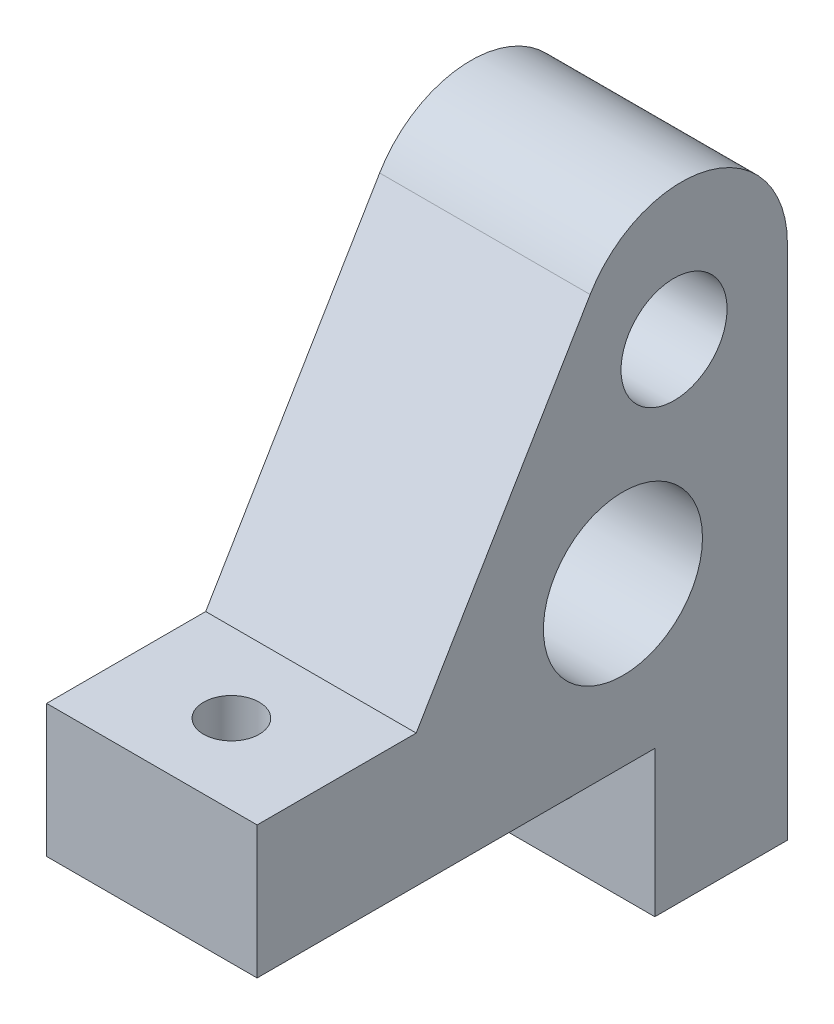
ISO-10303-21;
HEADER;
FILE_DESCRIPTION(('STEP AP214'),'2;1');
FILE_NAME('part.step','',(''),(''),'','','');
FILE_SCHEMA(('AUTOMOTIVE_DESIGN { 1 0 10303 214 1 1 1 1 }'));
ENDSEC;
DATA;
#1=APPLICATION_CONTEXT('core data for automotive mechanical design processes');
#2=APPLICATION_PROTOCOL_DEFINITION('international standard','automotive_design',2000,#1);
#3=PRODUCT_CONTEXT('',#1,'mechanical');
#4=PRODUCT('Part','Part','',(#3));
#5=PRODUCT_RELATED_PRODUCT_CATEGORY('part','',(#4));
#6=PRODUCT_DEFINITION_FORMATION('','',#4);
#7=PRODUCT_DEFINITION_CONTEXT('part definition',#1,'design');
#8=PRODUCT_DEFINITION('design','',#6,#7);
#9=PRODUCT_DEFINITION_SHAPE('','',#8);
#10=(LENGTH_UNIT() NAMED_UNIT(*) SI_UNIT(.MILLI.,.METRE.));
#11=(NAMED_UNIT(*) PLANE_ANGLE_UNIT() SI_UNIT($,.RADIAN.));
#12=(NAMED_UNIT(*) SI_UNIT($,.STERADIAN.) SOLID_ANGLE_UNIT());
#13=UNCERTAINTY_MEASURE_WITH_UNIT(LENGTH_MEASURE(1.E-05),#10,'distance_accuracy_value','');
#14=(GEOMETRIC_REPRESENTATION_CONTEXT(3) GLOBAL_UNCERTAINTY_ASSIGNED_CONTEXT((#13)) GLOBAL_UNIT_ASSIGNED_CONTEXT((#10,
#11,#12)) REPRESENTATION_CONTEXT('',''));
#15=CARTESIAN_POINT('',(0.,0.,0.));
#16=DIRECTION('',(0.,0.,1.));
#17=DIRECTION('',(1.,0.,0.));
#18=AXIS2_PLACEMENT_3D('',#15,#16,#17);
#19=CARTESIAN_POINT('',(7.94,28.,0.));
#20=DIRECTION('',(0.,0.,1.));
#21=DIRECTION('',(1.,0.,0.));
#22=AXIS2_PLACEMENT_3D('',#19,#20,#21);
#23=PLANE('',#22);
#24=CARTESIAN_POINT('',(0.,-4.99999999999983,-1.89735088484975E-12));
#25=DIRECTION('',(0.,0.,-1.));
#26=DIRECTION('',(-1.,0.,0.));
#27=AXIS2_PLACEMENT_3D('',#24,#25,#26);
#28=CIRCLE('',#27,2.09999999999999);
#29=CARTESIAN_POINT('',(-2.09999999999999,-4.99999999999983,-1.89735088484975E-12));
#30=VERTEX_POINT('',#29);
#31=EDGE_CURVE('E178',#30,#30,#28,.T.);
#32=ORIENTED_EDGE('',*,*,#31,.F.);
#33=EDGE_LOOP('',(#32));
#34=FACE_BOUND('',#33,.T.);
#35=DIRECTION('',(0.,1.,0.));
#36=VECTOR('',#35,1.);
#37=CARTESIAN_POINT('',(-7.94,28.,0.));
#38=LINE('',#37,#36);
#39=CARTESIAN_POINT('',(-7.94,-11.,0.));
#40=VERTEX_POINT('',#39);
#41=CARTESIAN_POINT('',(-7.94,28.,0.));
#42=VERTEX_POINT('',#41);
#43=EDGE_CURVE('E100',#40,#42,#38,.T.);
#44=ORIENTED_EDGE('',*,*,#43,.T.);
#45=DIRECTION('',(-1.,0.,0.));
#46=VECTOR('',#45,1.);
#47=CARTESIAN_POINT('',(7.94,28.,0.));
#48=LINE('',#47,#46);
#49=CARTESIAN_POINT('',(7.94,28.,0.));
#50=VERTEX_POINT('',#49);
#51=EDGE_CURVE('E13',#50,#42,#48,.T.);
#52=ORIENTED_EDGE('',*,*,#51,.F.);
#53=DIRECTION('',(0.,1.,0.));
#54=VECTOR('',#53,1.);
#55=CARTESIAN_POINT('',(7.94,-11.,0.));
#56=LINE('',#55,#54);
#57=CARTESIAN_POINT('',(7.94,-11.,0.));
#58=VERTEX_POINT('',#57);
#59=EDGE_CURVE('E106',#58,#50,#56,.T.);
#60=ORIENTED_EDGE('',*,*,#59,.F.);
#61=DIRECTION('',(-1.,0.,0.));
#62=VECTOR('',#61,1.);
#63=CARTESIAN_POINT('',(7.94,-11.,0.));
#64=LINE('',#63,#62);
#65=EDGE_CURVE('E140',#58,#40,#64,.T.);
#66=ORIENTED_EDGE('',*,*,#65,.T.);
#67=EDGE_LOOP('',(#44,#52,#60,#66));
#68=FACE_BOUND('',#67,.T.);
#69=ADVANCED_FACE('F46',(#34,#68),#23,.F.);
#70=CARTESIAN_POINT('',(7.94,28.,8.));
#71=DIRECTION('',(-1.,0.,0.));
#72=DIRECTION('',(0.,0.,1.));
#73=AXIS2_PLACEMENT_3D('',#70,#71,#72);
#74=CYLINDRICAL_SURFACE('',#73,8.);
#75=CARTESIAN_POINT('',(-7.94,28.,8.));
#76=DIRECTION('',(1.,0.,0.));
#77=DIRECTION('',(0.,0.,1.));
#78=AXIS2_PLACEMENT_3D('',#75,#76,#77);
#79=CIRCLE('',#78,8.);
#80=CARTESIAN_POINT('',(-7.94,32.0862906425039,14.8776615782535));
#81=VERTEX_POINT('',#80);
#82=EDGE_CURVE('E145',#42,#81,#79,.T.);
#83=ORIENTED_EDGE('',*,*,#82,.T.);
#84=DIRECTION('',(-1.,0.,0.));
#85=VECTOR('',#84,1.);
#86=CARTESIAN_POINT('',(7.94,32.0862906425039,14.8776615782535));
#87=LINE('',#86,#85);
#88=CARTESIAN_POINT('',(7.94,32.0862906425039,14.8776615782535));
#89=VERTEX_POINT('',#88);
#90=EDGE_CURVE('E55',#89,#81,#87,.T.);
#91=ORIENTED_EDGE('',*,*,#90,.F.);
#92=CARTESIAN_POINT('',(7.94,28.,8.));
#93=DIRECTION('',(1.,0.,0.));
#94=DIRECTION('',(0.,0.,1.));
#95=AXIS2_PLACEMENT_3D('',#92,#93,#94);
#96=CIRCLE('',#95,8.);
#97=EDGE_CURVE('E183',#50,#89,#96,.T.);
#98=ORIENTED_EDGE('',*,*,#97,.F.);
#99=ORIENTED_EDGE('',*,*,#51,.T.);
#100=EDGE_LOOP('',(#83,#91,#98,#99));
#101=FACE_BOUND('',#100,.T.);
#102=ADVANCED_FACE('F205',(#101),#74,.T.);
#103=CARTESIAN_POINT('',(7.94,32.0862906425039,14.8776615782535));
#104=DIRECTION('',(0.,-0.51078633031299,-0.859707697281692));
#105=DIRECTION('',(0.,0.859707697281692,-0.51078633031299));
#106=AXIS2_PLACEMENT_3D('',#103,#104,#105);
#107=PLANE('',#106);
#108=DIRECTION('',(0.,-0.859707697281692,0.51078633031299));
#109=VECTOR('',#108,1.);
#110=CARTESIAN_POINT('',(-7.94,32.0862906425039,14.8776615782535));
#111=LINE('',#110,#109);
#112=CARTESIAN_POINT('',(-7.94,10.,28.));
#113=VERTEX_POINT('',#112);
#114=EDGE_CURVE('E148',#81,#113,#111,.T.);
#115=ORIENTED_EDGE('',*,*,#114,.T.);
#116=DIRECTION('',(-1.,0.,0.));
#117=VECTOR('',#116,1.);
#118=CARTESIAN_POINT('',(7.94,10.,28.));
#119=LINE('',#118,#117);
#120=CARTESIAN_POINT('',(7.94,10.,28.));
#121=VERTEX_POINT('',#120);
#122=EDGE_CURVE('E165',#121,#113,#119,.T.);
#123=ORIENTED_EDGE('',*,*,#122,.F.);
#124=DIRECTION('',(0.,-0.859707697281692,0.51078633031299));
#125=VECTOR('',#124,1.);
#126=CARTESIAN_POINT('',(7.94,32.0862906425039,14.8776615782535));
#127=LINE('',#126,#125);
#128=EDGE_CURVE('E185',#89,#121,#127,.T.);
#129=ORIENTED_EDGE('',*,*,#128,.F.);
#130=ORIENTED_EDGE('',*,*,#90,.T.);
#131=EDGE_LOOP('',(#115,#123,#129,#130));
#132=FACE_BOUND('',#131,.T.);
#133=ADVANCED_FACE('F208',(#132),#107,.F.);
#134=CARTESIAN_POINT('',(7.94,10.,28.));
#135=DIRECTION('',(0.,-1.,0.));
#136=DIRECTION('',(0.,0.,-1.));
#137=AXIS2_PLACEMENT_3D('',#134,#135,#136);
#138=PLANE('',#137);
#139=CARTESIAN_POINT('',(0.,10.,33.9999999999962));
#140=DIRECTION('',(0.,1.,0.));
#141=DIRECTION('',(0.,0.,1.));
#142=AXIS2_PLACEMENT_3D('',#139,#140,#141);
#143=CIRCLE('',#142,2.09999999999999);
#144=CARTESIAN_POINT('',(0.,10.,36.0999999999962));
#145=VERTEX_POINT('',#144);
#146=EDGE_CURVE('E170',#145,#145,#143,.T.);
#147=ORIENTED_EDGE('',*,*,#146,.F.);
#148=EDGE_LOOP('',(#147));
#149=FACE_BOUND('',#148,.T.);
#150=DIRECTION('',(0.,0.,1.));
#151=VECTOR('',#150,1.);
#152=CARTESIAN_POINT('',(-7.94,10.,28.));
#153=LINE('',#152,#151);
#154=CARTESIAN_POINT('',(-7.94,10.,40.));
#155=VERTEX_POINT('',#154);
#156=EDGE_CURVE('E150',#113,#155,#153,.T.);
#157=ORIENTED_EDGE('',*,*,#156,.T.);
#158=DIRECTION('',(-1.,0.,0.));
#159=VECTOR('',#158,1.);
#160=CARTESIAN_POINT('',(7.94,10.,40.));
#161=LINE('',#160,#159);
#162=CARTESIAN_POINT('',(7.94,10.,40.));
#163=VERTEX_POINT('',#162);
#164=EDGE_CURVE('E162',#163,#155,#161,.T.);
#165=ORIENTED_EDGE('',*,*,#164,.F.);
#166=DIRECTION('',(0.,0.,1.));
#167=VECTOR('',#166,1.);
#168=CARTESIAN_POINT('',(7.94,10.,28.));
#169=LINE('',#168,#167);
#170=EDGE_CURVE('E187',#121,#163,#169,.T.);
#171=ORIENTED_EDGE('',*,*,#170,.F.);
#172=ORIENTED_EDGE('',*,*,#122,.T.);
#173=EDGE_LOOP('',(#157,#165,#171,#172));
#174=FACE_BOUND('',#173,.T.);
#175=ADVANCED_FACE('F193',(#149,#174),#138,.F.);
#176=CARTESIAN_POINT('',(7.94,10.,40.));
#177=DIRECTION('',(0.,0.,-1.));
#178=DIRECTION('',(-1.,0.,0.));
#179=AXIS2_PLACEMENT_3D('',#176,#177,#178);
#180=PLANE('',#179);
#181=DIRECTION('',(0.,-1.,0.));
#182=VECTOR('',#181,1.);
#183=CARTESIAN_POINT('',(-7.94,10.,40.));
#184=LINE('',#183,#182);
#185=CARTESIAN_POINT('',(-7.94,0.,40.));
#186=VERTEX_POINT('',#185);
#187=EDGE_CURVE('E152',#155,#186,#184,.T.);
#188=ORIENTED_EDGE('',*,*,#187,.T.);
#189=DIRECTION('',(-1.,0.,0.));
#190=VECTOR('',#189,1.);
#191=CARTESIAN_POINT('',(7.94,0.,40.));
#192=LINE('',#191,#190);
#193=CARTESIAN_POINT('',(7.94,0.,40.));
#194=VERTEX_POINT('',#193);
#195=EDGE_CURVE('E135',#194,#186,#192,.T.);
#196=ORIENTED_EDGE('',*,*,#195,.F.);
#197=DIRECTION('',(0.,-1.,0.));
#198=VECTOR('',#197,1.);
#199=CARTESIAN_POINT('',(7.94,10.,40.));
#200=LINE('',#199,#198);
#201=EDGE_CURVE('E126',#163,#194,#200,.T.);
#202=ORIENTED_EDGE('',*,*,#201,.F.);
#203=ORIENTED_EDGE('',*,*,#164,.T.);
#204=EDGE_LOOP('',(#188,#196,#202,#203));
#205=FACE_BOUND('',#204,.T.);
#206=ADVANCED_FACE('F197',(#205),#180,.F.);
#207=CARTESIAN_POINT('',(7.94,0.,40.));
#208=DIRECTION('',(0.,1.,0.));
#209=DIRECTION('',(0.,0.,1.));
#210=AXIS2_PLACEMENT_3D('',#207,#208,#209);
#211=PLANE('',#210);
#212=CARTESIAN_POINT('',(0.,0.,33.9999999999962));
#213=DIRECTION('',(0.,1.,0.));
#214=DIRECTION('',(0.,0.,1.));
#215=AXIS2_PLACEMENT_3D('',#212,#213,#214);
#216=CIRCLE('',#215,2.09999999999999);
#217=CARTESIAN_POINT('',(0.,0.,36.0999999999962));
#218=VERTEX_POINT('',#217);
#219=EDGE_CURVE('E146',#218,#218,#216,.T.);
#220=ORIENTED_EDGE('',*,*,#219,.T.);
#221=EDGE_LOOP('',(#220));
#222=FACE_BOUND('',#221,.T.);
#223=DIRECTION('',(0.,0.,-1.));
#224=VECTOR('',#223,1.);
#225=CARTESIAN_POINT('',(-7.94,0.,40.));
#226=LINE('',#225,#224);
#227=CARTESIAN_POINT('',(-7.94,0.,10.));
#228=VERTEX_POINT('',#227);
#229=EDGE_CURVE('E134',#186,#228,#226,.T.);
#230=ORIENTED_EDGE('',*,*,#229,.T.);
#231=DIRECTION('',(-1.,0.,0.));
#232=VECTOR('',#231,1.);
#233=CARTESIAN_POINT('',(7.94,0.,10.));
#234=LINE('',#233,#232);
#235=CARTESIAN_POINT('',(7.94,0.,10.));
#236=VERTEX_POINT('',#235);
#237=EDGE_CURVE('E131',#236,#228,#234,.T.);
#238=ORIENTED_EDGE('',*,*,#237,.F.);
#239=DIRECTION('',(0.,0.,-1.));
#240=VECTOR('',#239,1.);
#241=CARTESIAN_POINT('',(7.94,0.,40.));
#242=LINE('',#241,#240);
#243=EDGE_CURVE('E120',#194,#236,#242,.T.);
#244=ORIENTED_EDGE('',*,*,#243,.F.);
#245=ORIENTED_EDGE('',*,*,#195,.T.);
#246=EDGE_LOOP('',(#230,#238,#244,#245));
#247=FACE_BOUND('',#246,.T.);
#248=ADVANCED_FACE('F132',(#222,#247),#211,.F.);
#249=CARTESIAN_POINT('',(7.94,0.,10.));
#250=DIRECTION('',(0.,0.,-1.));
#251=DIRECTION('',(0.,1.,0.));
#252=AXIS2_PLACEMENT_3D('',#249,#250,#251);
#253=PLANE('',#252);
#254=CARTESIAN_POINT('',(0.,-4.99999999999983,10.));
#255=DIRECTION('',(0.,0.,-1.));
#256=DIRECTION('',(0.,1.,0.));
#257=AXIS2_PLACEMENT_3D('',#254,#255,#256);
#258=CIRCLE('',#257,2.09999999999999);
#259=CARTESIAN_POINT('',(0.,-2.89999999999984,10.));
#260=VERTEX_POINT('',#259);
#261=EDGE_CURVE('E49',#260,#260,#258,.T.);
#262=ORIENTED_EDGE('',*,*,#261,.T.);
#263=EDGE_LOOP('',(#262));
#264=FACE_BOUND('',#263,.T.);
#265=DIRECTION('',(0.,-1.,0.));
#266=VECTOR('',#265,1.);
#267=CARTESIAN_POINT('',(-7.94,0.,10.));
#268=LINE('',#267,#266);
#269=CARTESIAN_POINT('',(-7.94,-11.,10.));
#270=VERTEX_POINT('',#269);
#271=EDGE_CURVE('E93',#228,#270,#268,.T.);
#272=ORIENTED_EDGE('',*,*,#271,.T.);
#273=DIRECTION('',(-1.,0.,0.));
#274=VECTOR('',#273,1.);
#275=CARTESIAN_POINT('',(7.94,-11.,10.));
#276=LINE('',#275,#274);
#277=CARTESIAN_POINT('',(7.94,-11.,10.));
#278=VERTEX_POINT('',#277);
#279=EDGE_CURVE('E136',#278,#270,#276,.T.);
#280=ORIENTED_EDGE('',*,*,#279,.F.);
#281=DIRECTION('',(0.,-1.,0.));
#282=VECTOR('',#281,1.);
#283=CARTESIAN_POINT('',(7.94,0.,10.));
#284=LINE('',#283,#282);
#285=EDGE_CURVE('E124',#236,#278,#284,.T.);
#286=ORIENTED_EDGE('',*,*,#285,.F.);
#287=ORIENTED_EDGE('',*,*,#237,.T.);
#288=EDGE_LOOP('',(#272,#280,#286,#287));
#289=FACE_BOUND('',#288,.T.);
#290=ADVANCED_FACE('F138',(#264,#289),#253,.F.);
#291=CARTESIAN_POINT('',(7.94,-11.,10.));
#292=DIRECTION('',(0.,1.,0.));
#293=DIRECTION('',(0.,0.,1.));
#294=AXIS2_PLACEMENT_3D('',#291,#292,#293);
#295=PLANE('',#294);
#296=DIRECTION('',(0.,0.,-1.));
#297=VECTOR('',#296,1.);
#298=CARTESIAN_POINT('',(-7.94,-11.,10.));
#299=LINE('',#298,#297);
#300=EDGE_CURVE('E156',#270,#40,#299,.T.);
#301=ORIENTED_EDGE('',*,*,#300,.T.);
#302=ORIENTED_EDGE('',*,*,#65,.F.);
#303=DIRECTION('',(0.,0.,-1.));
#304=VECTOR('',#303,1.);
#305=CARTESIAN_POINT('',(7.94,-11.,10.));
#306=LINE('',#305,#304);
#307=EDGE_CURVE('E64',#278,#58,#306,.T.);
#308=ORIENTED_EDGE('',*,*,#307,.F.);
#309=ORIENTED_EDGE('',*,*,#279,.T.);
#310=EDGE_LOOP('',(#301,#302,#308,#309));
#311=FACE_BOUND('',#310,.T.);
#312=ADVANCED_FACE('F200',(#311),#295,.F.);
#313=CARTESIAN_POINT('',(7.94,28.,8.));
#314=DIRECTION('',(-1.,0.,0.));
#315=DIRECTION('',(0.,0.,1.));
#316=AXIS2_PLACEMENT_3D('',#313,#314,#315);
#317=PLANE('',#316);
#318=CARTESIAN_POINT('',(7.94,25.9934780709859,8.55111024937508));
#319=DIRECTION('',(1.,0.,0.));
#320=DIRECTION('',(0.,0.,-1.));
#321=AXIS2_PLACEMENT_3D('',#318,#319,#320);
#322=CIRCLE('',#321,4.);
#323=CARTESIAN_POINT('',(7.94,25.9934780709859,4.55111024937508));
#324=VERTEX_POINT('',#323);
#325=EDGE_CURVE('E233',#324,#324,#322,.T.);
#326=ORIENTED_EDGE('',*,*,#325,.F.);
#327=EDGE_LOOP('',(#326));
#328=FACE_BOUND('',#327,.T.);
#329=CARTESIAN_POINT('',(7.94,11.9619981955409,12.4049890739426));
#330=DIRECTION('',(1.,0.,0.));
#331=DIRECTION('',(0.,0.,-1.));
#332=AXIS2_PLACEMENT_3D('',#329,#330,#331);
#333=CIRCLE('',#332,6.);
#334=CARTESIAN_POINT('',(7.94,11.9619981955409,6.4049890739426));
#335=VERTEX_POINT('',#334);
#336=EDGE_CURVE('E226',#335,#335,#333,.T.);
#337=ORIENTED_EDGE('',*,*,#336,.F.);
#338=EDGE_LOOP('',(#337));
#339=FACE_BOUND('',#338,.T.);
#340=ORIENTED_EDGE('',*,*,#59,.T.);
#341=ORIENTED_EDGE('',*,*,#97,.T.);
#342=ORIENTED_EDGE('',*,*,#128,.T.);
#343=ORIENTED_EDGE('',*,*,#170,.T.);
#344=ORIENTED_EDGE('',*,*,#201,.T.);
#345=ORIENTED_EDGE('',*,*,#243,.T.);
#346=ORIENTED_EDGE('',*,*,#285,.T.);
#347=ORIENTED_EDGE('',*,*,#307,.T.);
#348=EDGE_LOOP('',(#340,#341,#342,#343,#344,#345,#346,#347));
#349=FACE_BOUND('',#348,.T.);
#350=ADVANCED_FACE('F122',(#328,#339,#349),#317,.F.);
#351=CARTESIAN_POINT('',(-7.94,28.,8.));
#352=DIRECTION('',(-1.,0.,0.));
#353=DIRECTION('',(0.,0.,1.));
#354=AXIS2_PLACEMENT_3D('',#351,#352,#353);
#355=PLANE('',#354);
#356=CARTESIAN_POINT('',(-7.94,25.9934780709859,8.55111024937508));
#357=DIRECTION('',(1.,0.,0.));
#358=DIRECTION('',(0.,0.,-1.));
#359=AXIS2_PLACEMENT_3D('',#356,#357,#358);
#360=CIRCLE('',#359,4.);
#361=CARTESIAN_POINT('',(-7.94,25.9934780709859,4.55111024937508));
#362=VERTEX_POINT('',#361);
#363=EDGE_CURVE('E231',#362,#362,#360,.T.);
#364=ORIENTED_EDGE('',*,*,#363,.T.);
#365=EDGE_LOOP('',(#364));
#366=FACE_BOUND('',#365,.T.);
#367=CARTESIAN_POINT('',(-7.94,11.9619981955409,12.4049890739426));
#368=DIRECTION('',(1.,0.,0.));
#369=DIRECTION('',(0.,0.,-1.));
#370=AXIS2_PLACEMENT_3D('',#367,#368,#369);
#371=CIRCLE('',#370,6.);
#372=CARTESIAN_POINT('',(-7.94,11.9619981955409,6.4049890739426));
#373=VERTEX_POINT('',#372);
#374=EDGE_CURVE('E224',#373,#373,#371,.T.);
#375=ORIENTED_EDGE('',*,*,#374,.T.);
#376=EDGE_LOOP('',(#375));
#377=FACE_BOUND('',#376,.T.);
#378=ORIENTED_EDGE('',*,*,#43,.F.);
#379=ORIENTED_EDGE('',*,*,#300,.F.);
#380=ORIENTED_EDGE('',*,*,#271,.F.);
#381=ORIENTED_EDGE('',*,*,#229,.F.);
#382=ORIENTED_EDGE('',*,*,#187,.F.);
#383=ORIENTED_EDGE('',*,*,#156,.F.);
#384=ORIENTED_EDGE('',*,*,#114,.F.);
#385=ORIENTED_EDGE('',*,*,#82,.F.);
#386=EDGE_LOOP('',(#378,#379,#380,#381,#382,#383,#384,#385));
#387=FACE_BOUND('',#386,.T.);
#388=ADVANCED_FACE('F198',(#366,#377,#387),#355,.T.);
#389=CARTESIAN_POINT('',(0.,10.,33.9999999999962));
#390=DIRECTION('',(0.,1.,0.));
#391=DIRECTION('',(0.,0.,1.));
#392=AXIS2_PLACEMENT_3D('',#389,#390,#391);
#393=CYLINDRICAL_SURFACE('',#392,2.09999999999999);
#394=ORIENTED_EDGE('',*,*,#146,.T.);
#395=EDGE_LOOP('',(#394));
#396=FACE_BOUND('',#395,.T.);
#397=ORIENTED_EDGE('',*,*,#219,.F.);
#398=EDGE_LOOP('',(#397));
#399=FACE_BOUND('',#398,.T.);
#400=ADVANCED_FACE('F259',(#396,#399),#393,.F.);
#401=CARTESIAN_POINT('',(0.,-4.99999999999983,-1.89605275924265E-12));
#402=DIRECTION('',(0.,0.,-1.));
#403=DIRECTION('',(-1.,0.,0.));
#404=AXIS2_PLACEMENT_3D('',#401,#402,#403);
#405=CYLINDRICAL_SURFACE('',#404,2.09999999999999);
#406=ORIENTED_EDGE('',*,*,#31,.T.);
#407=EDGE_LOOP('',(#406));
#408=FACE_BOUND('',#407,.T.);
#409=ORIENTED_EDGE('',*,*,#261,.F.);
#410=EDGE_LOOP('',(#409));
#411=FACE_BOUND('',#410,.T.);
#412=ADVANCED_FACE('F253',(#408,#411),#405,.F.);
#413=CARTESIAN_POINT('',(-7.94,11.9619981955409,12.4049890739426));
#414=DIRECTION('',(1.,0.,0.));
#415=DIRECTION('',(0.,0.,-1.));
#416=AXIS2_PLACEMENT_3D('',#413,#414,#415);
#417=CYLINDRICAL_SURFACE('',#416,6.);
#418=ORIENTED_EDGE('',*,*,#374,.F.);
#419=EDGE_LOOP('',(#418));
#420=FACE_BOUND('',#419,.T.);
#421=ORIENTED_EDGE('',*,*,#336,.T.);
#422=EDGE_LOOP('',(#421));
#423=FACE_BOUND('',#422,.T.);
#424=ADVANCED_FACE('F243',(#420,#423),#417,.F.);
#425=CARTESIAN_POINT('',(-7.94,25.9934780709859,8.55111024937508));
#426=DIRECTION('',(1.,0.,0.));
#427=DIRECTION('',(0.,0.,-1.));
#428=AXIS2_PLACEMENT_3D('',#425,#426,#427);
#429=CYLINDRICAL_SURFACE('',#428,4.);
#430=ORIENTED_EDGE('',*,*,#363,.F.);
#431=EDGE_LOOP('',(#430));
#432=FACE_BOUND('',#431,.T.);
#433=ORIENTED_EDGE('',*,*,#325,.T.);
#434=EDGE_LOOP('',(#433));
#435=FACE_BOUND('',#434,.T.);
#436=ADVANCED_FACE('F240',(#432,#435),#429,.F.);
#437=CLOSED_SHELL('',(#69,#102,#133,#175,#206,#248,#290,#312,#350,#388,#400,#412,#424,#436));
#438=MANIFOLD_SOLID_BREP('B2',#437);
#439=ADVANCED_BREP_SHAPE_REPRESENTATION('',(#18,#438),#14);
#440=SHAPE_DEFINITION_REPRESENTATION(#9,#439);
ENDSEC;
END-ISO-10303-21;
